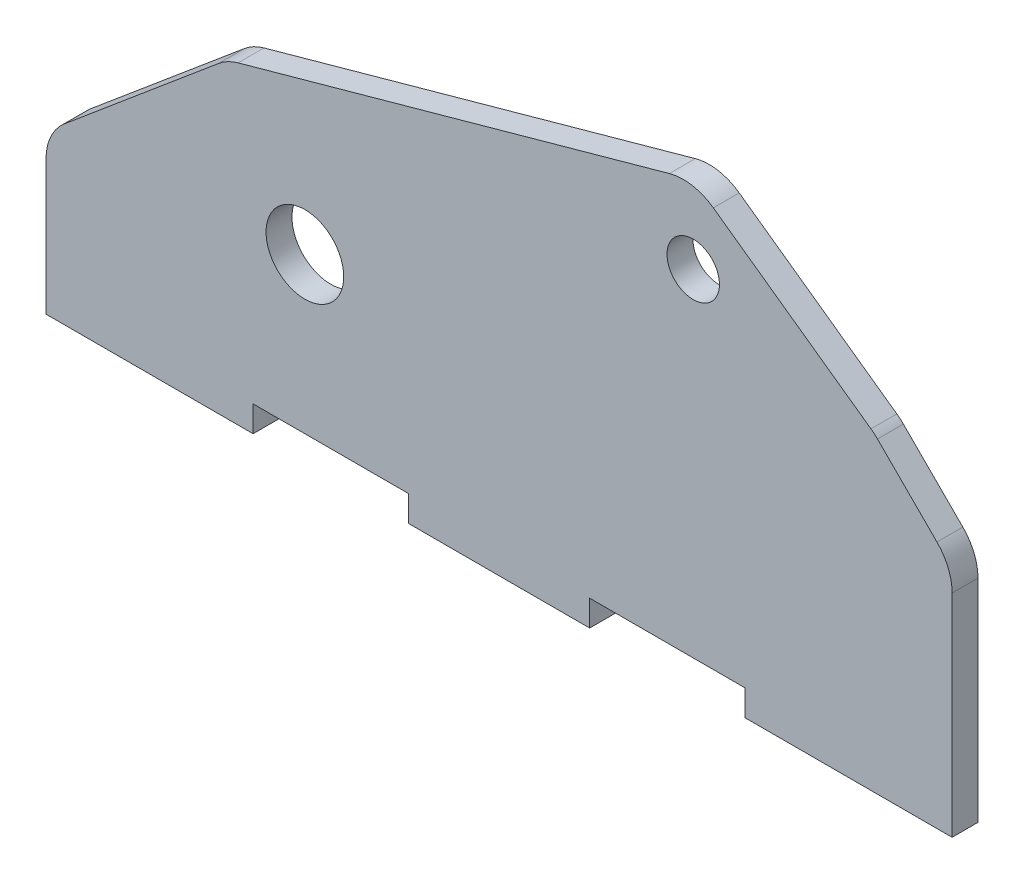
ISO-10303-21;
HEADER;
FILE_DESCRIPTION(('STEP AP214'),'2;1');
FILE_NAME('part.step','',(''),(''),'','','');
FILE_SCHEMA(('AUTOMOTIVE_DESIGN { 1 0 10303 214 1 1 1 1 }'));
ENDSEC;
DATA;
#1=APPLICATION_CONTEXT('core data for automotive mechanical design processes');
#2=APPLICATION_PROTOCOL_DEFINITION('international standard','automotive_design',2000,#1);
#3=PRODUCT_CONTEXT('',#1,'mechanical');
#4=PRODUCT('Part','Part','',(#3));
#5=PRODUCT_RELATED_PRODUCT_CATEGORY('part','',(#4));
#6=PRODUCT_DEFINITION_FORMATION('','',#4);
#7=PRODUCT_DEFINITION_CONTEXT('part definition',#1,'design');
#8=PRODUCT_DEFINITION('design','',#6,#7);
#9=PRODUCT_DEFINITION_SHAPE('','',#8);
#10=(LENGTH_UNIT() NAMED_UNIT(*) SI_UNIT(.MILLI.,.METRE.));
#11=(NAMED_UNIT(*) PLANE_ANGLE_UNIT() SI_UNIT($,.RADIAN.));
#12=(NAMED_UNIT(*) SI_UNIT($,.STERADIAN.) SOLID_ANGLE_UNIT());
#13=UNCERTAINTY_MEASURE_WITH_UNIT(LENGTH_MEASURE(1.E-05),#10,'distance_accuracy_value','');
#14=(GEOMETRIC_REPRESENTATION_CONTEXT(3) GLOBAL_UNCERTAINTY_ASSIGNED_CONTEXT((#13)) GLOBAL_UNIT_ASSIGNED_CONTEXT((#10,
#11,#12)) REPRESENTATION_CONTEXT('',''));
#15=CARTESIAN_POINT('',(0.,0.,0.));
#16=DIRECTION('',(0.,0.,1.));
#17=DIRECTION('',(1.,0.,0.));
#18=AXIS2_PLACEMENT_3D('',#15,#16,#17);
#19=CARTESIAN_POINT('',(0.,0.,10.));
#20=DIRECTION('',(0.,0.,-1.));
#21=DIRECTION('',(-1.,0.,0.));
#22=AXIS2_PLACEMENT_3D('',#19,#20,#21);
#23=PLANE('',#22);
#24=CARTESIAN_POINT('',(100.,70.,10.));
#25=DIRECTION('',(0.,0.,1.));
#26=DIRECTION('',(1.,0.,0.));
#27=AXIS2_PLACEMENT_3D('',#24,#25,#26);
#28=CIRCLE('',#27,15.);
#29=CARTESIAN_POINT('',(115.,70.,10.));
#30=VERTEX_POINT('',#29);
#31=EDGE_CURVE('E415',#30,#30,#28,.T.);
#32=ORIENTED_EDGE('',*,*,#31,.F.);
#33=EDGE_LOOP('',(#32));
#34=FACE_BOUND('',#33,.T.);
#35=DIRECTION('',(-0.766044443118979,-0.642787609686538,0.));
#36=VECTOR('',#35,1.);
#37=CARTESIAN_POINT('',(70.,120.,10.));
#38=LINE('',#37,#36);
#39=CARTESIAN_POINT('',(66.6768843984014,117.211574924339,10.));
#40=VERTEX_POINT('',#39);
#41=CARTESIAN_POINT('',(7.14424780626927,67.2577615168702,10.));
#42=VERTEX_POINT('',#41);
#43=EDGE_CURVE('E271',#40,#42,#38,.T.);
#44=ORIENTED_EDGE('',*,*,#43,.T.);
#45=CARTESIAN_POINT('',(20.,51.9368726544906,10.));
#46=DIRECTION('',(0.,0.,-1.));
#47=DIRECTION('',(-1.,0.,0.));
#48=AXIS2_PLACEMENT_3D('',#45,#46,#47);
#49=CIRCLE('',#48,20.);
#50=CARTESIAN_POINT('',(0.,51.9368726544906,10.));
#51=VERTEX_POINT('',#50);
#52=EDGE_CURVE('E177',#42,#51,#49,.F.);
#53=ORIENTED_EDGE('',*,*,#52,.T.);
#54=DIRECTION('',(0.,-1.,0.));
#55=VECTOR('',#54,1.);
#56=CARTESIAN_POINT('',(0.,0.,10.));
#57=LINE('',#56,#55);
#58=CARTESIAN_POINT('',(0.,0.,10.));
#59=VERTEX_POINT('',#58);
#60=EDGE_CURVE('E170',#51,#59,#57,.T.);
#61=ORIENTED_EDGE('',*,*,#60,.T.);
#62=DIRECTION('',(1.,0.,0.));
#63=VECTOR('',#62,1.);
#64=CARTESIAN_POINT('',(0.,0.,10.));
#65=LINE('',#64,#63);
#66=CARTESIAN_POINT('',(80.,0.,10.));
#67=VERTEX_POINT('',#66);
#68=EDGE_CURVE('E174',#59,#67,#65,.T.);
#69=ORIENTED_EDGE('',*,*,#68,.T.);
#70=DIRECTION('',(0.,1.,0.));
#71=VECTOR('',#70,1.);
#72=CARTESIAN_POINT('',(80.,0.,10.));
#73=LINE('',#72,#71);
#74=CARTESIAN_POINT('',(80.,10.,10.));
#75=VERTEX_POINT('',#74);
#76=EDGE_CURVE('E191',#67,#75,#73,.T.);
#77=ORIENTED_EDGE('',*,*,#76,.T.);
#78=DIRECTION('',(1.,0.,0.));
#79=VECTOR('',#78,1.);
#80=CARTESIAN_POINT('',(80.,10.,10.));
#81=LINE('',#80,#79);
#82=CARTESIAN_POINT('',(140.,10.,10.));
#83=VERTEX_POINT('',#82);
#84=EDGE_CURVE('E296',#75,#83,#81,.T.);
#85=ORIENTED_EDGE('',*,*,#84,.T.);
#86=DIRECTION('',(0.,-1.,0.));
#87=VECTOR('',#86,1.);
#88=CARTESIAN_POINT('',(140.,10.,10.));
#89=LINE('',#88,#87);
#90=CARTESIAN_POINT('',(140.,0.,10.));
#91=VERTEX_POINT('',#90);
#92=EDGE_CURVE('E417',#83,#91,#89,.T.);
#93=ORIENTED_EDGE('',*,*,#92,.T.);
#94=DIRECTION('',(1.,0.,0.));
#95=VECTOR('',#94,1.);
#96=CARTESIAN_POINT('',(140.,0.,10.));
#97=LINE('',#96,#95);
#98=CARTESIAN_POINT('',(210.,0.,10.));
#99=VERTEX_POINT('',#98);
#100=EDGE_CURVE('E421',#91,#99,#97,.T.);
#101=ORIENTED_EDGE('',*,*,#100,.T.);
#102=DIRECTION('',(0.,1.,0.));
#103=VECTOR('',#102,1.);
#104=CARTESIAN_POINT('',(210.,0.,10.));
#105=LINE('',#104,#103);
#106=CARTESIAN_POINT('',(210.,10.,10.));
#107=VERTEX_POINT('',#106);
#108=EDGE_CURVE('E423',#99,#107,#105,.T.);
#109=ORIENTED_EDGE('',*,*,#108,.T.);
#110=DIRECTION('',(1.,0.,0.));
#111=VECTOR('',#110,1.);
#112=CARTESIAN_POINT('',(210.,10.,10.));
#113=LINE('',#112,#111);
#114=CARTESIAN_POINT('',(270.,10.,10.));
#115=VERTEX_POINT('',#114);
#116=EDGE_CURVE('E425',#107,#115,#113,.T.);
#117=ORIENTED_EDGE('',*,*,#116,.T.);
#118=DIRECTION('',(0.,-1.,0.));
#119=VECTOR('',#118,1.);
#120=CARTESIAN_POINT('',(270.,10.,10.));
#121=LINE('',#120,#119);
#122=CARTESIAN_POINT('',(270.,0.,10.));
#123=VERTEX_POINT('',#122);
#124=EDGE_CURVE('E427',#115,#123,#121,.T.);
#125=ORIENTED_EDGE('',*,*,#124,.T.);
#126=DIRECTION('',(1.,0.,0.));
#127=VECTOR('',#126,1.);
#128=CARTESIAN_POINT('',(270.,0.,10.));
#129=LINE('',#128,#127);
#130=CARTESIAN_POINT('',(350.,0.,10.));
#131=VERTEX_POINT('',#130);
#132=EDGE_CURVE('E429',#123,#131,#129,.T.);
#133=ORIENTED_EDGE('',*,*,#132,.T.);
#134=DIRECTION('',(0.,1.,0.));
#135=VECTOR('',#134,1.);
#136=CARTESIAN_POINT('',(350.,0.,10.));
#137=LINE('',#136,#135);
#138=CARTESIAN_POINT('',(350.,81.7157287525381,10.));
#139=VERTEX_POINT('',#138);
#140=EDGE_CURVE('E431',#131,#139,#137,.T.);
#141=ORIENTED_EDGE('',*,*,#140,.T.);
#142=CARTESIAN_POINT('',(330.,81.7157287525381,10.));
#143=DIRECTION('',(0.,0.,-1.));
#144=DIRECTION('',(-1.,0.,0.));
#145=AXIS2_PLACEMENT_3D('',#142,#143,#144);
#146=CIRCLE('',#145,20.);
#147=CARTESIAN_POINT('',(344.142135623731,95.8578643762691,10.));
#148=VERTEX_POINT('',#147);
#149=EDGE_CURVE('E222',#139,#148,#146,.F.);
#150=ORIENTED_EDGE('',*,*,#149,.T.);
#151=DIRECTION('',(-0.707106781186548,0.707106781186547,0.));
#152=VECTOR('',#151,1.);
#153=CARTESIAN_POINT('',(350.,90.,10.));
#154=LINE('',#153,#152);
#155=CARTESIAN_POINT('',(321.17043892804,118.829561071959,10.));
#156=VERTEX_POINT('',#155);
#157=EDGE_CURVE('E250',#148,#156,#154,.T.);
#158=ORIENTED_EDGE('',*,*,#157,.T.);
#159=CARTESIAN_POINT('',(307.02830330431,104.687425448229,10.));
#160=DIRECTION('',(0.,0.,-1.));
#161=DIRECTION('',(-1.,0.,0.));
#162=AXIS2_PLACEMENT_3D('',#159,#160,#161);
#163=CIRCLE('',#162,20.);
#164=CARTESIAN_POINT('',(318.653067178691,120.962094872363,10.));
#165=VERTEX_POINT('',#164);
#166=EDGE_CURVE('E220',#156,#165,#163,.F.);
#167=ORIENTED_EDGE('',*,*,#166,.T.);
#168=DIRECTION('',(-0.813733471206735,0.581238193719097,0.));
#169=VECTOR('',#168,1.);
#170=CARTESIAN_POINT('',(320.,120.,10.));
#171=LINE('',#170,#169);
#172=CARTESIAN_POINT('',(257.773393800641,164.447575856685,10.));
#173=VERTEX_POINT('',#172);
#174=EDGE_CURVE('E242',#165,#173,#171,.T.);
#175=ORIENTED_EDGE('',*,*,#174,.T.);
#176=CARTESIAN_POINT('',(246.148629926259,148.17290643255,10.));
#177=DIRECTION('',(0.,0.,-1.));
#178=DIRECTION('',(-1.,0.,0.));
#179=AXIS2_PLACEMENT_3D('',#176,#177,#178);
#180=CIRCLE('',#179,20.);
#181=CARTESIAN_POINT('',(240.795752650537,167.443264625149,10.));
#182=VERTEX_POINT('',#181);
#183=EDGE_CURVE('E55',#173,#182,#180,.F.);
#184=ORIENTED_EDGE('',*,*,#183,.T.);
#185=DIRECTION('',(-0.963517909629941,-0.267643863786095,0.));
#186=VECTOR('',#185,1.);
#187=CARTESIAN_POINT('',(250.,170.,10.));
#188=LINE('',#187,#186);
#189=CARTESIAN_POINT('',(74.1797593164103,121.161044254558,10.));
#190=VERTEX_POINT('',#189);
#191=EDGE_CURVE('E249',#182,#190,#188,.T.);
#192=ORIENTED_EDGE('',*,*,#191,.T.);
#193=CARTESIAN_POINT('',(79.5326365921322,101.89068606196,10.));
#194=DIRECTION('',(0.,0.,-1.));
#195=DIRECTION('',(-1.,0.,0.));
#196=AXIS2_PLACEMENT_3D('',#193,#194,#195);
#197=CIRCLE('',#196,20.);
#198=EDGE_CURVE('E224',#190,#40,#197,.F.);
#199=ORIENTED_EDGE('',*,*,#198,.T.);
#200=EDGE_LOOP('',(#44,#53,#61,#69,#77,#85,#93,#101,#109,#117,#125,#133,#141,#150,#158,#167,
#175,#184,#192,#199));
#201=FACE_BOUND('',#200,.T.);
#202=CARTESIAN_POINT('',(250.,140.,10.));
#203=DIRECTION('',(0.,0.,1.));
#204=DIRECTION('',(1.,0.,0.));
#205=AXIS2_PLACEMENT_3D('',#202,#203,#204);
#206=CIRCLE('',#205,10.1249999999999);
#207=CARTESIAN_POINT('',(260.125,140.,10.));
#208=VERTEX_POINT('',#207);
#209=EDGE_CURVE('E458',#208,#208,#206,.T.);
#210=ORIENTED_EDGE('',*,*,#209,.F.);
#211=EDGE_LOOP('',(#210));
#212=FACE_BOUND('',#211,.T.);
#213=ADVANCED_FACE('F33',(#34,#201,#212),#23,.F.);
#214=CARTESIAN_POINT('',(0.,0.,0.));
#215=DIRECTION('',(0.,0.,-1.));
#216=DIRECTION('',(-1.,0.,0.));
#217=AXIS2_PLACEMENT_3D('',#214,#215,#216);
#218=PLANE('',#217);
#219=CARTESIAN_POINT('',(100.,70.,0.));
#220=DIRECTION('',(0.,0.,1.));
#221=DIRECTION('',(1.,0.,0.));
#222=AXIS2_PLACEMENT_3D('',#219,#220,#221);
#223=CIRCLE('',#222,15.);
#224=CARTESIAN_POINT('',(115.,70.,0.));
#225=VERTEX_POINT('',#224);
#226=EDGE_CURVE('E455',#225,#225,#223,.T.);
#227=ORIENTED_EDGE('',*,*,#226,.T.);
#228=EDGE_LOOP('',(#227));
#229=FACE_BOUND('',#228,.T.);
#230=DIRECTION('',(0.,-1.,0.));
#231=VECTOR('',#230,1.);
#232=CARTESIAN_POINT('',(0.,0.,0.));
#233=LINE('',#232,#231);
#234=CARTESIAN_POINT('',(0.,51.9368726544906,0.));
#235=VERTEX_POINT('',#234);
#236=CARTESIAN_POINT('',(0.,0.,0.));
#237=VERTEX_POINT('',#236);
#238=EDGE_CURVE('E195',#235,#237,#233,.T.);
#239=ORIENTED_EDGE('',*,*,#238,.F.);
#240=CARTESIAN_POINT('',(20.,51.9368726544906,0.));
#241=DIRECTION('',(0.,0.,-1.));
#242=DIRECTION('',(-1.,0.,0.));
#243=AXIS2_PLACEMENT_3D('',#240,#241,#242);
#244=CIRCLE('',#243,20.);
#245=CARTESIAN_POINT('',(7.14424780626927,67.2577615168702,0.));
#246=VERTEX_POINT('',#245);
#247=EDGE_CURVE('E212',#235,#246,#244,.T.);
#248=ORIENTED_EDGE('',*,*,#247,.T.);
#249=DIRECTION('',(-0.766044443118979,-0.642787609686538,0.));
#250=VECTOR('',#249,1.);
#251=CARTESIAN_POINT('',(70.,120.,0.));
#252=LINE('',#251,#250);
#253=CARTESIAN_POINT('',(66.6768843984014,117.211574924339,0.));
#254=VERTEX_POINT('',#253);
#255=EDGE_CURVE('E182',#254,#246,#252,.T.);
#256=ORIENTED_EDGE('',*,*,#255,.F.);
#257=CARTESIAN_POINT('',(79.5326365921322,101.89068606196,0.));
#258=DIRECTION('',(0.,0.,-1.));
#259=DIRECTION('',(-1.,0.,0.));
#260=AXIS2_PLACEMENT_3D('',#257,#258,#259);
#261=CIRCLE('',#260,20.);
#262=CARTESIAN_POINT('',(74.1797593164103,121.161044254558,0.));
#263=VERTEX_POINT('',#262);
#264=EDGE_CURVE('E210',#254,#263,#261,.T.);
#265=ORIENTED_EDGE('',*,*,#264,.T.);
#266=DIRECTION('',(-0.963517909629941,-0.267643863786095,0.));
#267=VECTOR('',#266,1.);
#268=CARTESIAN_POINT('',(250.,170.,0.));
#269=LINE('',#268,#267);
#270=CARTESIAN_POINT('',(240.795752650537,167.443264625149,0.));
#271=VERTEX_POINT('',#270);
#272=EDGE_CURVE('E255',#271,#263,#269,.T.);
#273=ORIENTED_EDGE('',*,*,#272,.F.);
#274=CARTESIAN_POINT('',(246.148629926259,148.17290643255,0.));
#275=DIRECTION('',(0.,0.,-1.));
#276=DIRECTION('',(-1.,0.,0.));
#277=AXIS2_PLACEMENT_3D('',#274,#275,#276);
#278=CIRCLE('',#277,20.);
#279=CARTESIAN_POINT('',(257.773393800641,164.447575856685,0.));
#280=VERTEX_POINT('',#279);
#281=EDGE_CURVE('E199',#271,#280,#278,.T.);
#282=ORIENTED_EDGE('',*,*,#281,.T.);
#283=DIRECTION('',(-0.813733471206735,0.581238193719097,0.));
#284=VECTOR('',#283,1.);
#285=CARTESIAN_POINT('',(320.,120.,0.));
#286=LINE('',#285,#284);
#287=CARTESIAN_POINT('',(318.653067178691,120.962094872363,0.));
#288=VERTEX_POINT('',#287);
#289=EDGE_CURVE('E245',#288,#280,#286,.T.);
#290=ORIENTED_EDGE('',*,*,#289,.F.);
#291=CARTESIAN_POINT('',(307.02830330431,104.687425448229,0.));
#292=DIRECTION('',(0.,0.,-1.));
#293=DIRECTION('',(-1.,0.,0.));
#294=AXIS2_PLACEMENT_3D('',#291,#292,#293);
#295=CIRCLE('',#294,20.);
#296=CARTESIAN_POINT('',(321.17043892804,118.829561071959,0.));
#297=VERTEX_POINT('',#296);
#298=EDGE_CURVE('E206',#288,#297,#295,.T.);
#299=ORIENTED_EDGE('',*,*,#298,.T.);
#300=DIRECTION('',(-0.707106781186548,0.707106781186547,0.));
#301=VECTOR('',#300,1.);
#302=CARTESIAN_POINT('',(350.,90.,0.));
#303=LINE('',#302,#301);
#304=CARTESIAN_POINT('',(344.142135623731,95.8578643762691,0.));
#305=VERTEX_POINT('',#304);
#306=EDGE_CURVE('E263',#305,#297,#303,.T.);
#307=ORIENTED_EDGE('',*,*,#306,.F.);
#308=CARTESIAN_POINT('',(330.,81.7157287525381,0.));
#309=DIRECTION('',(0.,0.,-1.));
#310=DIRECTION('',(-1.,0.,0.));
#311=AXIS2_PLACEMENT_3D('',#308,#309,#310);
#312=CIRCLE('',#311,20.);
#313=CARTESIAN_POINT('',(350.,81.7157287525381,0.));
#314=VERTEX_POINT('',#313);
#315=EDGE_CURVE('E208',#305,#314,#312,.T.);
#316=ORIENTED_EDGE('',*,*,#315,.T.);
#317=DIRECTION('',(0.,1.,0.));
#318=VECTOR('',#317,1.);
#319=CARTESIAN_POINT('',(350.,0.,0.));
#320=LINE('',#319,#318);
#321=CARTESIAN_POINT('',(350.,0.,0.));
#322=VERTEX_POINT('',#321);
#323=EDGE_CURVE('E319',#322,#314,#320,.T.);
#324=ORIENTED_EDGE('',*,*,#323,.F.);
#325=DIRECTION('',(1.,0.,0.));
#326=VECTOR('',#325,1.);
#327=CARTESIAN_POINT('',(270.,0.,0.));
#328=LINE('',#327,#326);
#329=CARTESIAN_POINT('',(270.,0.,0.));
#330=VERTEX_POINT('',#329);
#331=EDGE_CURVE('E317',#330,#322,#328,.T.);
#332=ORIENTED_EDGE('',*,*,#331,.F.);
#333=DIRECTION('',(0.,-1.,0.));
#334=VECTOR('',#333,1.);
#335=CARTESIAN_POINT('',(270.,10.,0.));
#336=LINE('',#335,#334);
#337=CARTESIAN_POINT('',(270.,10.,0.));
#338=VERTEX_POINT('',#337);
#339=EDGE_CURVE('E315',#338,#330,#336,.T.);
#340=ORIENTED_EDGE('',*,*,#339,.F.);
#341=DIRECTION('',(1.,0.,0.));
#342=VECTOR('',#341,1.);
#343=CARTESIAN_POINT('',(210.,10.,0.));
#344=LINE('',#343,#342);
#345=CARTESIAN_POINT('',(210.,10.,0.));
#346=VERTEX_POINT('',#345);
#347=EDGE_CURVE('E313',#346,#338,#344,.T.);
#348=ORIENTED_EDGE('',*,*,#347,.F.);
#349=DIRECTION('',(0.,1.,0.));
#350=VECTOR('',#349,1.);
#351=CARTESIAN_POINT('',(210.,0.,0.));
#352=LINE('',#351,#350);
#353=CARTESIAN_POINT('',(210.,0.,0.));
#354=VERTEX_POINT('',#353);
#355=EDGE_CURVE('E311',#354,#346,#352,.T.);
#356=ORIENTED_EDGE('',*,*,#355,.F.);
#357=DIRECTION('',(1.,0.,0.));
#358=VECTOR('',#357,1.);
#359=CARTESIAN_POINT('',(140.,0.,0.));
#360=LINE('',#359,#358);
#361=CARTESIAN_POINT('',(140.,0.,0.));
#362=VERTEX_POINT('',#361);
#363=EDGE_CURVE('E304',#362,#354,#360,.T.);
#364=ORIENTED_EDGE('',*,*,#363,.F.);
#365=DIRECTION('',(0.,-1.,0.));
#366=VECTOR('',#365,1.);
#367=CARTESIAN_POINT('',(140.,10.,0.));
#368=LINE('',#367,#366);
#369=CARTESIAN_POINT('',(140.,10.,0.));
#370=VERTEX_POINT('',#369);
#371=EDGE_CURVE('E302',#370,#362,#368,.T.);
#372=ORIENTED_EDGE('',*,*,#371,.F.);
#373=DIRECTION('',(1.,0.,0.));
#374=VECTOR('',#373,1.);
#375=CARTESIAN_POINT('',(80.,10.,0.));
#376=LINE('',#375,#374);
#377=CARTESIAN_POINT('',(80.,10.,0.));
#378=VERTEX_POINT('',#377);
#379=EDGE_CURVE('E295',#378,#370,#376,.T.);
#380=ORIENTED_EDGE('',*,*,#379,.F.);
#381=DIRECTION('',(0.,1.,0.));
#382=VECTOR('',#381,1.);
#383=CARTESIAN_POINT('',(80.,0.,0.));
#384=LINE('',#383,#382);
#385=CARTESIAN_POINT('',(80.,0.,0.));
#386=VERTEX_POINT('',#385);
#387=EDGE_CURVE('E300',#386,#378,#384,.T.);
#388=ORIENTED_EDGE('',*,*,#387,.F.);
#389=DIRECTION('',(1.,0.,0.));
#390=VECTOR('',#389,1.);
#391=CARTESIAN_POINT('',(0.,0.,0.));
#392=LINE('',#391,#390);
#393=EDGE_CURVE('E306',#237,#386,#392,.T.);
#394=ORIENTED_EDGE('',*,*,#393,.F.);
#395=EDGE_LOOP('',(#239,#248,#256,#265,#273,#282,#290,#299,#307,#316,#324,#332,#340,#348,#356,
#364,#372,#380,#388,#394));
#396=FACE_BOUND('',#395,.T.);
#397=CARTESIAN_POINT('',(250.,140.,0.));
#398=DIRECTION('',(0.,0.,1.));
#399=DIRECTION('',(1.,0.,0.));
#400=AXIS2_PLACEMENT_3D('',#397,#398,#399);
#401=CIRCLE('',#400,10.1249999999999);
#402=CARTESIAN_POINT('',(260.125,140.,0.));
#403=VERTEX_POINT('',#402);
#404=EDGE_CURVE('E461',#403,#403,#401,.T.);
#405=ORIENTED_EDGE('',*,*,#404,.T.);
#406=EDGE_LOOP('',(#405));
#407=FACE_BOUND('',#406,.T.);
#408=ADVANCED_FACE('F257',(#229,#396,#407),#218,.T.);
#409=CARTESIAN_POINT('',(0.,0.,10.));
#410=DIRECTION('',(1.,0.,0.));
#411=DIRECTION('',(0.,1.,0.));
#412=AXIS2_PLACEMENT_3D('',#409,#410,#411);
#413=PLANE('',#412);
#414=ORIENTED_EDGE('',*,*,#60,.F.);
#415=DIRECTION('',(0.,0.,-1.));
#416=VECTOR('',#415,1.);
#417=CARTESIAN_POINT('',(0.,51.9368726544906,10.));
#418=LINE('',#417,#416);
#419=EDGE_CURVE('E197',#51,#235,#418,.T.);
#420=ORIENTED_EDGE('',*,*,#419,.T.);
#421=ORIENTED_EDGE('',*,*,#238,.T.);
#422=DIRECTION('',(0.,0.,-1.));
#423=VECTOR('',#422,1.);
#424=CARTESIAN_POINT('',(0.,0.,10.));
#425=LINE('',#424,#423);
#426=EDGE_CURVE('E187',#59,#237,#425,.T.);
#427=ORIENTED_EDGE('',*,*,#426,.F.);
#428=EDGE_LOOP('',(#414,#420,#421,#427));
#429=FACE_BOUND('',#428,.T.);
#430=ADVANCED_FACE('F193',(#429),#413,.F.);
#431=CARTESIAN_POINT('',(0.,0.,10.));
#432=DIRECTION('',(0.,1.,0.));
#433=DIRECTION('',(0.,0.,1.));
#434=AXIS2_PLACEMENT_3D('',#431,#432,#433);
#435=PLANE('',#434);
#436=ORIENTED_EDGE('',*,*,#393,.T.);
#437=DIRECTION('',(0.,0.,-1.));
#438=VECTOR('',#437,1.);
#439=CARTESIAN_POINT('',(80.,0.,10.));
#440=LINE('',#439,#438);
#441=EDGE_CURVE('E189',#67,#386,#440,.T.);
#442=ORIENTED_EDGE('',*,*,#441,.F.);
#443=ORIENTED_EDGE('',*,*,#68,.F.);
#444=ORIENTED_EDGE('',*,*,#426,.T.);
#445=EDGE_LOOP('',(#436,#442,#443,#444));
#446=FACE_BOUND('',#445,.T.);
#447=ADVANCED_FACE('F186',(#446),#435,.F.);
#448=CARTESIAN_POINT('',(80.,0.,10.));
#449=DIRECTION('',(-1.,0.,0.));
#450=DIRECTION('',(0.,0.,1.));
#451=AXIS2_PLACEMENT_3D('',#448,#449,#450);
#452=PLANE('',#451);
#453=ORIENTED_EDGE('',*,*,#387,.T.);
#454=DIRECTION('',(0.,0.,-1.));
#455=VECTOR('',#454,1.);
#456=CARTESIAN_POINT('',(80.,10.,10.));
#457=LINE('',#456,#455);
#458=EDGE_CURVE('E201',#75,#378,#457,.T.);
#459=ORIENTED_EDGE('',*,*,#458,.F.);
#460=ORIENTED_EDGE('',*,*,#76,.F.);
#461=ORIENTED_EDGE('',*,*,#441,.T.);
#462=EDGE_LOOP('',(#453,#459,#460,#461));
#463=FACE_BOUND('',#462,.T.);
#464=ADVANCED_FACE('F392',(#463),#452,.F.);
#465=CARTESIAN_POINT('',(80.,10.,10.));
#466=DIRECTION('',(0.,1.,0.));
#467=DIRECTION('',(0.,0.,1.));
#468=AXIS2_PLACEMENT_3D('',#465,#466,#467);
#469=PLANE('',#468);
#470=ORIENTED_EDGE('',*,*,#379,.T.);
#471=DIRECTION('',(0.,0.,-1.));
#472=VECTOR('',#471,1.);
#473=CARTESIAN_POINT('',(140.,10.,10.));
#474=LINE('',#473,#472);
#475=EDGE_CURVE('E286',#83,#370,#474,.T.);
#476=ORIENTED_EDGE('',*,*,#475,.F.);
#477=ORIENTED_EDGE('',*,*,#84,.F.);
#478=ORIENTED_EDGE('',*,*,#458,.T.);
#479=EDGE_LOOP('',(#470,#476,#477,#478));
#480=FACE_BOUND('',#479,.T.);
#481=ADVANCED_FACE('F293',(#480),#469,.F.);
#482=CARTESIAN_POINT('',(140.,10.,10.));
#483=DIRECTION('',(1.,0.,0.));
#484=DIRECTION('',(0.,0.,-1.));
#485=AXIS2_PLACEMENT_3D('',#482,#483,#484);
#486=PLANE('',#485);
#487=ORIENTED_EDGE('',*,*,#371,.T.);
#488=DIRECTION('',(0.,0.,-1.));
#489=VECTOR('',#488,1.);
#490=CARTESIAN_POINT('',(140.,0.,10.));
#491=LINE('',#490,#489);
#492=EDGE_CURVE('E283',#91,#362,#491,.T.);
#493=ORIENTED_EDGE('',*,*,#492,.F.);
#494=ORIENTED_EDGE('',*,*,#92,.F.);
#495=ORIENTED_EDGE('',*,*,#475,.T.);
#496=EDGE_LOOP('',(#487,#493,#494,#495));
#497=FACE_BOUND('',#496,.T.);
#498=ADVANCED_FACE('F385',(#497),#486,.F.);
#499=CARTESIAN_POINT('',(140.,0.,10.));
#500=DIRECTION('',(0.,1.,0.));
#501=DIRECTION('',(0.,0.,1.));
#502=AXIS2_PLACEMENT_3D('',#499,#500,#501);
#503=PLANE('',#502);
#504=ORIENTED_EDGE('',*,*,#363,.T.);
#505=DIRECTION('',(0.,0.,-1.));
#506=VECTOR('',#505,1.);
#507=CARTESIAN_POINT('',(210.,0.,10.));
#508=LINE('',#507,#506);
#509=EDGE_CURVE('E280',#99,#354,#508,.T.);
#510=ORIENTED_EDGE('',*,*,#509,.F.);
#511=ORIENTED_EDGE('',*,*,#100,.F.);
#512=ORIENTED_EDGE('',*,*,#492,.T.);
#513=EDGE_LOOP('',(#504,#510,#511,#512));
#514=FACE_BOUND('',#513,.T.);
#515=ADVANCED_FACE('F381',(#514),#503,.F.);
#516=CARTESIAN_POINT('',(210.,0.,10.));
#517=DIRECTION('',(-1.,0.,0.));
#518=DIRECTION('',(0.,0.,1.));
#519=AXIS2_PLACEMENT_3D('',#516,#517,#518);
#520=PLANE('',#519);
#521=ORIENTED_EDGE('',*,*,#355,.T.);
#522=DIRECTION('',(0.,0.,-1.));
#523=VECTOR('',#522,1.);
#524=CARTESIAN_POINT('',(210.,10.,10.));
#525=LINE('',#524,#523);
#526=EDGE_CURVE('E277',#107,#346,#525,.T.);
#527=ORIENTED_EDGE('',*,*,#526,.F.);
#528=ORIENTED_EDGE('',*,*,#108,.F.);
#529=ORIENTED_EDGE('',*,*,#509,.T.);
#530=EDGE_LOOP('',(#521,#527,#528,#529));
#531=FACE_BOUND('',#530,.T.);
#532=ADVANCED_FACE('F377',(#531),#520,.F.);
#533=CARTESIAN_POINT('',(210.,10.,10.));
#534=DIRECTION('',(0.,1.,0.));
#535=DIRECTION('',(0.,0.,1.));
#536=AXIS2_PLACEMENT_3D('',#533,#534,#535);
#537=PLANE('',#536);
#538=ORIENTED_EDGE('',*,*,#347,.T.);
#539=DIRECTION('',(0.,0.,-1.));
#540=VECTOR('',#539,1.);
#541=CARTESIAN_POINT('',(270.,10.,10.));
#542=LINE('',#541,#540);
#543=EDGE_CURVE('E274',#115,#338,#542,.T.);
#544=ORIENTED_EDGE('',*,*,#543,.F.);
#545=ORIENTED_EDGE('',*,*,#116,.F.);
#546=ORIENTED_EDGE('',*,*,#526,.T.);
#547=EDGE_LOOP('',(#538,#544,#545,#546));
#548=FACE_BOUND('',#547,.T.);
#549=ADVANCED_FACE('F373',(#548),#537,.F.);
#550=CARTESIAN_POINT('',(270.,10.,10.));
#551=DIRECTION('',(1.,0.,0.));
#552=DIRECTION('',(0.,0.,-1.));
#553=AXIS2_PLACEMENT_3D('',#550,#551,#552);
#554=PLANE('',#553);
#555=ORIENTED_EDGE('',*,*,#339,.T.);
#556=DIRECTION('',(0.,0.,-1.));
#557=VECTOR('',#556,1.);
#558=CARTESIAN_POINT('',(270.,0.,10.));
#559=LINE('',#558,#557);
#560=EDGE_CURVE('E270',#123,#330,#559,.T.);
#561=ORIENTED_EDGE('',*,*,#560,.F.);
#562=ORIENTED_EDGE('',*,*,#124,.F.);
#563=ORIENTED_EDGE('',*,*,#543,.T.);
#564=EDGE_LOOP('',(#555,#561,#562,#563));
#565=FACE_BOUND('',#564,.T.);
#566=ADVANCED_FACE('F369',(#565),#554,.F.);
#567=CARTESIAN_POINT('',(270.,0.,10.));
#568=DIRECTION('',(0.,1.,0.));
#569=DIRECTION('',(0.,0.,1.));
#570=AXIS2_PLACEMENT_3D('',#567,#568,#569);
#571=PLANE('',#570);
#572=ORIENTED_EDGE('',*,*,#331,.T.);
#573=DIRECTION('',(0.,0.,-1.));
#574=VECTOR('',#573,1.);
#575=CARTESIAN_POINT('',(350.,0.,10.));
#576=LINE('',#575,#574);
#577=EDGE_CURVE('E267',#131,#322,#576,.T.);
#578=ORIENTED_EDGE('',*,*,#577,.F.);
#579=ORIENTED_EDGE('',*,*,#132,.F.);
#580=ORIENTED_EDGE('',*,*,#560,.T.);
#581=EDGE_LOOP('',(#572,#578,#579,#580));
#582=FACE_BOUND('',#581,.T.);
#583=ADVANCED_FACE('F365',(#582),#571,.F.);
#584=CARTESIAN_POINT('',(350.,0.,10.));
#585=DIRECTION('',(-1.,0.,0.));
#586=DIRECTION('',(0.,0.,1.));
#587=AXIS2_PLACEMENT_3D('',#584,#585,#586);
#588=PLANE('',#587);
#589=ORIENTED_EDGE('',*,*,#323,.T.);
#590=DIRECTION('',(0.,0.,-1.));
#591=VECTOR('',#590,1.);
#592=CARTESIAN_POINT('',(350.,81.7157287525381,10.));
#593=LINE('',#592,#591);
#594=EDGE_CURVE('E236',#314,#139,#593,.F.);
#595=ORIENTED_EDGE('',*,*,#594,.T.);
#596=ORIENTED_EDGE('',*,*,#140,.F.);
#597=ORIENTED_EDGE('',*,*,#577,.T.);
#598=EDGE_LOOP('',(#589,#595,#596,#597));
#599=FACE_BOUND('',#598,.T.);
#600=ADVANCED_FACE('F362',(#599),#588,.F.);
#601=CARTESIAN_POINT('',(350.,90.,10.));
#602=DIRECTION('',(-0.707106781186547,-0.707106781186548,0.));
#603=DIRECTION('',(0.707106781186548,-0.707106781186547,0.));
#604=AXIS2_PLACEMENT_3D('',#601,#602,#603);
#605=PLANE('',#604);
#606=ORIENTED_EDGE('',*,*,#157,.F.);
#607=DIRECTION('',(0.,0.,-1.));
#608=VECTOR('',#607,1.);
#609=CARTESIAN_POINT('',(344.142135623731,95.8578643762691,10.));
#610=LINE('',#609,#608);
#611=EDGE_CURVE('E233',#148,#305,#610,.T.);
#612=ORIENTED_EDGE('',*,*,#611,.T.);
#613=ORIENTED_EDGE('',*,*,#306,.T.);
#614=DIRECTION('',(0.,0.,-1.));
#615=VECTOR('',#614,1.);
#616=CARTESIAN_POINT('',(321.17043892804,118.829561071959,10.));
#617=LINE('',#616,#615);
#618=EDGE_CURVE('E231',#297,#156,#617,.F.);
#619=ORIENTED_EDGE('',*,*,#618,.T.);
#620=EDGE_LOOP('',(#606,#612,#613,#619));
#621=FACE_BOUND('',#620,.T.);
#622=ADVANCED_FACE('F326',(#621),#605,.F.);
#623=CARTESIAN_POINT('',(320.,120.,10.));
#624=DIRECTION('',(-0.581238193719097,-0.813733471206735,0.));
#625=DIRECTION('',(0.813733471206735,-0.581238193719097,0.));
#626=AXIS2_PLACEMENT_3D('',#623,#624,#625);
#627=PLANE('',#626);
#628=ORIENTED_EDGE('',*,*,#174,.F.);
#629=DIRECTION('',(0.,0.,-1.));
#630=VECTOR('',#629,1.);
#631=CARTESIAN_POINT('',(318.653067178691,120.962094872363,10.));
#632=LINE('',#631,#630);
#633=EDGE_CURVE('E11',#165,#288,#632,.T.);
#634=ORIENTED_EDGE('',*,*,#633,.T.);
#635=ORIENTED_EDGE('',*,*,#289,.T.);
#636=DIRECTION('',(0.,0.,-1.));
#637=VECTOR('',#636,1.);
#638=CARTESIAN_POINT('',(257.773393800641,164.447575856685,10.));
#639=LINE('',#638,#637);
#640=EDGE_CURVE('E41',#280,#173,#639,.F.);
#641=ORIENTED_EDGE('',*,*,#640,.T.);
#642=EDGE_LOOP('',(#628,#634,#635,#641));
#643=FACE_BOUND('',#642,.T.);
#644=ADVANCED_FACE('F241',(#643),#627,.F.);
#645=CARTESIAN_POINT('',(250.,170.,10.));
#646=DIRECTION('',(0.267643863786095,-0.963517909629941,0.));
#647=DIRECTION('',(0.963517909629941,0.267643863786095,0.));
#648=AXIS2_PLACEMENT_3D('',#645,#646,#647);
#649=PLANE('',#648);
#650=ORIENTED_EDGE('',*,*,#272,.T.);
#651=DIRECTION('',(0.,0.,-1.));
#652=VECTOR('',#651,1.);
#653=CARTESIAN_POINT('',(74.1797593164103,121.161044254558,10.));
#654=LINE('',#653,#652);
#655=EDGE_CURVE('E48',#263,#190,#654,.F.);
#656=ORIENTED_EDGE('',*,*,#655,.T.);
#657=ORIENTED_EDGE('',*,*,#191,.F.);
#658=DIRECTION('',(0.,0.,-1.));
#659=VECTOR('',#658,1.);
#660=CARTESIAN_POINT('',(240.795752650537,167.443264625149,10.));
#661=LINE('',#660,#659);
#662=EDGE_CURVE('E227',#182,#271,#661,.T.);
#663=ORIENTED_EDGE('',*,*,#662,.T.);
#664=EDGE_LOOP('',(#650,#656,#657,#663));
#665=FACE_BOUND('',#664,.T.);
#666=ADVANCED_FACE('F254',(#665),#649,.F.);
#667=CARTESIAN_POINT('',(70.,120.,10.));
#668=DIRECTION('',(0.642787609686538,-0.766044443118979,0.));
#669=DIRECTION('',(0.766044443118979,0.642787609686538,0.));
#670=AXIS2_PLACEMENT_3D('',#667,#668,#669);
#671=PLANE('',#670);
#672=ORIENTED_EDGE('',*,*,#255,.T.);
#673=DIRECTION('',(0.,0.,-1.));
#674=VECTOR('',#673,1.);
#675=CARTESIAN_POINT('',(7.14424780626924,67.2577615168701,10.));
#676=LINE('',#675,#674);
#677=EDGE_CURVE('E217',#246,#42,#676,.F.);
#678=ORIENTED_EDGE('',*,*,#677,.T.);
#679=ORIENTED_EDGE('',*,*,#43,.F.);
#680=DIRECTION('',(0.,0.,-1.));
#681=VECTOR('',#680,1.);
#682=CARTESIAN_POINT('',(66.6768843984014,117.211574924339,10.));
#683=LINE('',#682,#681);
#684=EDGE_CURVE('E214',#40,#254,#683,.T.);
#685=ORIENTED_EDGE('',*,*,#684,.T.);
#686=EDGE_LOOP('',(#672,#678,#679,#685));
#687=FACE_BOUND('',#686,.T.);
#688=ADVANCED_FACE('F352',(#687),#671,.F.);
#689=CARTESIAN_POINT('',(100.,70.,10.));
#690=DIRECTION('',(0.,0.,-1.));
#691=DIRECTION('',(-1.,0.,0.));
#692=AXIS2_PLACEMENT_3D('',#689,#690,#691);
#693=CYLINDRICAL_SURFACE('',#692,15.);
#694=ORIENTED_EDGE('',*,*,#31,.T.);
#695=EDGE_LOOP('',(#694));
#696=FACE_BOUND('',#695,.T.);
#697=ORIENTED_EDGE('',*,*,#226,.F.);
#698=EDGE_LOOP('',(#697));
#699=FACE_BOUND('',#698,.T.);
#700=ADVANCED_FACE('F349',(#696,#699),#693,.F.);
#701=CARTESIAN_POINT('',(250.,140.,10.));
#702=DIRECTION('',(0.,0.,-1.));
#703=DIRECTION('',(-1.,0.,0.));
#704=AXIS2_PLACEMENT_3D('',#701,#702,#703);
#705=CYLINDRICAL_SURFACE('',#704,10.1249999999999);
#706=ORIENTED_EDGE('',*,*,#209,.T.);
#707=EDGE_LOOP('',(#706));
#708=FACE_BOUND('',#707,.T.);
#709=ORIENTED_EDGE('',*,*,#404,.F.);
#710=EDGE_LOOP('',(#709));
#711=FACE_BOUND('',#710,.T.);
#712=ADVANCED_FACE('F402',(#708,#711),#705,.F.);
#713=CARTESIAN_POINT('',(20.,51.9368726544906,10.));
#714=DIRECTION('',(0.,0.,-1.));
#715=DIRECTION('',(-1.,0.,0.));
#716=AXIS2_PLACEMENT_3D('',#713,#714,#715);
#717=CYLINDRICAL_SURFACE('',#716,20.);
#718=ORIENTED_EDGE('',*,*,#52,.F.);
#719=ORIENTED_EDGE('',*,*,#677,.F.);
#720=ORIENTED_EDGE('',*,*,#247,.F.);
#721=ORIENTED_EDGE('',*,*,#419,.F.);
#722=EDGE_LOOP('',(#718,#719,#720,#721));
#723=FACE_BOUND('',#722,.T.);
#724=ADVANCED_FACE('F399',(#723),#717,.T.);
#725=CARTESIAN_POINT('',(79.5326365921322,101.89068606196,10.));
#726=DIRECTION('',(0.,0.,-1.));
#727=DIRECTION('',(-1.,0.,0.));
#728=AXIS2_PLACEMENT_3D('',#725,#726,#727);
#729=CYLINDRICAL_SURFACE('',#728,20.);
#730=ORIENTED_EDGE('',*,*,#198,.F.);
#731=ORIENTED_EDGE('',*,*,#655,.F.);
#732=ORIENTED_EDGE('',*,*,#264,.F.);
#733=ORIENTED_EDGE('',*,*,#684,.F.);
#734=EDGE_LOOP('',(#730,#731,#732,#733));
#735=FACE_BOUND('',#734,.T.);
#736=ADVANCED_FACE('F336',(#735),#729,.T.);
#737=CARTESIAN_POINT('',(330.,81.7157287525381,10.));
#738=DIRECTION('',(0.,0.,-1.));
#739=DIRECTION('',(-1.,0.,0.));
#740=AXIS2_PLACEMENT_3D('',#737,#738,#739);
#741=CYLINDRICAL_SURFACE('',#740,20.);
#742=ORIENTED_EDGE('',*,*,#149,.F.);
#743=ORIENTED_EDGE('',*,*,#594,.F.);
#744=ORIENTED_EDGE('',*,*,#315,.F.);
#745=ORIENTED_EDGE('',*,*,#611,.F.);
#746=EDGE_LOOP('',(#742,#743,#744,#745));
#747=FACE_BOUND('',#746,.T.);
#748=ADVANCED_FACE('F331',(#747),#741,.T.);
#749=CARTESIAN_POINT('',(307.02830330431,104.687425448229,10.));
#750=DIRECTION('',(0.,0.,-1.));
#751=DIRECTION('',(-1.,0.,0.));
#752=AXIS2_PLACEMENT_3D('',#749,#750,#751);
#753=CYLINDRICAL_SURFACE('',#752,20.);
#754=ORIENTED_EDGE('',*,*,#166,.F.);
#755=ORIENTED_EDGE('',*,*,#618,.F.);
#756=ORIENTED_EDGE('',*,*,#298,.F.);
#757=ORIENTED_EDGE('',*,*,#633,.F.);
#758=EDGE_LOOP('',(#754,#755,#756,#757));
#759=FACE_BOUND('',#758,.T.);
#760=ADVANCED_FACE('F329',(#759),#753,.T.);
#761=CARTESIAN_POINT('',(246.148629926259,148.17290643255,10.));
#762=DIRECTION('',(0.,0.,-1.));
#763=DIRECTION('',(-1.,0.,0.));
#764=AXIS2_PLACEMENT_3D('',#761,#762,#763);
#765=CYLINDRICAL_SURFACE('',#764,20.);
#766=ORIENTED_EDGE('',*,*,#183,.F.);
#767=ORIENTED_EDGE('',*,*,#640,.F.);
#768=ORIENTED_EDGE('',*,*,#281,.F.);
#769=ORIENTED_EDGE('',*,*,#662,.F.);
#770=EDGE_LOOP('',(#766,#767,#768,#769));
#771=FACE_BOUND('',#770,.T.);
#772=ADVANCED_FACE('F35',(#771),#765,.T.);
#773=CLOSED_SHELL('',(#213,#408,#430,#447,#464,#481,#498,#515,#532,#549,#566,#583,#600,#622,
#644,#666,#688,#700,#712,#724,#736,#748,#760,#772));
#774=MANIFOLD_SOLID_BREP('B2',#773);
#775=ADVANCED_BREP_SHAPE_REPRESENTATION('',(#18,#774),#14);
#776=SHAPE_DEFINITION_REPRESENTATION(#9,#775);
ENDSEC;
END-ISO-10303-21;
